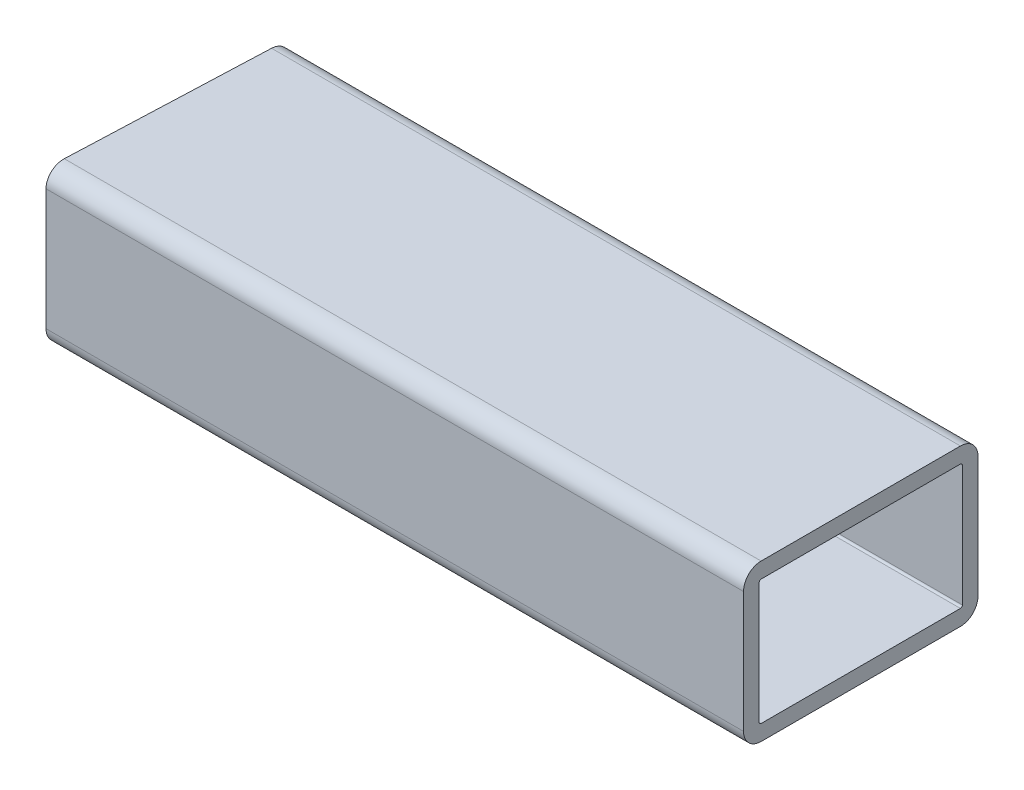
ISO-10303-21;
HEADER;
FILE_DESCRIPTION(('STEP AP214'),'2;1');
FILE_NAME('part.step','',(''),(''),'','','');
FILE_SCHEMA(('AUTOMOTIVE_DESIGN { 1 0 10303 214 1 1 1 1 }'));
ENDSEC;
DATA;
#1=APPLICATION_CONTEXT('core data for automotive mechanical design processes');
#2=APPLICATION_PROTOCOL_DEFINITION('international standard','automotive_design',2000,#1);
#3=PRODUCT_CONTEXT('',#1,'mechanical');
#4=PRODUCT('Part','Part','',(#3));
#5=PRODUCT_RELATED_PRODUCT_CATEGORY('part','',(#4));
#6=PRODUCT_DEFINITION_FORMATION('','',#4);
#7=PRODUCT_DEFINITION_CONTEXT('part definition',#1,'design');
#8=PRODUCT_DEFINITION('design','',#6,#7);
#9=PRODUCT_DEFINITION_SHAPE('','',#8);
#10=(LENGTH_UNIT() NAMED_UNIT(*) SI_UNIT(.MILLI.,.METRE.));
#11=(NAMED_UNIT(*) PLANE_ANGLE_UNIT() SI_UNIT($,.RADIAN.));
#12=(NAMED_UNIT(*) SI_UNIT($,.STERADIAN.) SOLID_ANGLE_UNIT());
#13=UNCERTAINTY_MEASURE_WITH_UNIT(LENGTH_MEASURE(1.E-05),#10,'distance_accuracy_value','');
#14=(GEOMETRIC_REPRESENTATION_CONTEXT(3) GLOBAL_UNCERTAINTY_ASSIGNED_CONTEXT((#13)) GLOBAL_UNIT_ASSIGNED_CONTEXT((#10,
#11,#12)) REPRESENTATION_CONTEXT('',''));
#15=CARTESIAN_POINT('',(0.,0.,0.));
#16=DIRECTION('',(0.,0.,1.));
#17=DIRECTION('',(1.,0.,0.));
#18=AXIS2_PLACEMENT_3D('',#15,#16,#17);
#19=CARTESIAN_POINT('',(178.5,15.5,25.5));
#20=DIRECTION('',(-1.,0.,0.));
#21=DIRECTION('',(0.,0.,1.));
#22=AXIS2_PLACEMENT_3D('',#19,#20,#21);
#23=CYLINDRICAL_SURFACE('',#22,4.5);
#24=DIRECTION('',(-1.,0.,0.));
#25=VECTOR('',#24,1.);
#26=CARTESIAN_POINT('',(178.5,20.,25.5));
#27=LINE('',#26,#25);
#28=CARTESIAN_POINT('',(178.5,20.,25.5));
#29=VERTEX_POINT('',#28);
#30=CARTESIAN_POINT('',(0.180000000000001,20.,25.5));
#31=VERTEX_POINT('',#30);
#32=EDGE_CURVE('E204',#29,#31,#27,.T.);
#33=ORIENTED_EDGE('',*,*,#32,.T.);
#34=CARTESIAN_POINT('',(0.180000000000013,15.5,25.5));
#35=DIRECTION('',(0.999200958721789,0.,0.0399680383488718));
#36=DIRECTION('',(-0.0399680383488718,0.,0.999200958721789));
#37=AXIS2_PLACEMENT_3D('',#34,#35,#36);
#38=ELLIPSE('',#37,4.50359856115085,4.5);
#39=CARTESIAN_POINT('',(0.,15.5,30.));
#40=VERTEX_POINT('',#39);
#41=EDGE_CURVE('E203',#31,#40,#38,.T.);
#42=ORIENTED_EDGE('',*,*,#41,.T.);
#43=DIRECTION('',(-1.,0.,0.));
#44=VECTOR('',#43,1.);
#45=CARTESIAN_POINT('',(178.5,15.5,30.));
#46=LINE('',#45,#44);
#47=CARTESIAN_POINT('',(178.5,15.5,30.));
#48=VERTEX_POINT('',#47);
#49=EDGE_CURVE('E12',#48,#40,#46,.T.);
#50=ORIENTED_EDGE('',*,*,#49,.F.);
#51=CARTESIAN_POINT('',(178.5,15.5,25.5));
#52=DIRECTION('',(1.,0.,0.));
#53=DIRECTION('',(0.,0.,-1.));
#54=AXIS2_PLACEMENT_3D('',#51,#52,#53);
#55=CIRCLE('',#54,4.5);
#56=EDGE_CURVE('E273',#29,#48,#55,.T.);
#57=ORIENTED_EDGE('',*,*,#56,.F.);
#58=EDGE_LOOP('',(#33,#42,#50,#57));
#59=FACE_BOUND('',#58,.T.);
#60=ADVANCED_FACE('F80',(#59),#23,.T.);
#61=CARTESIAN_POINT('',(178.5,15.5,30.));
#62=DIRECTION('',(0.,0.,-1.));
#63=DIRECTION('',(-1.,0.,0.));
#64=AXIS2_PLACEMENT_3D('',#61,#62,#63);
#65=PLANE('',#64);
#66=DIRECTION('',(0.,-1.,0.));
#67=VECTOR('',#66,1.);
#68=CARTESIAN_POINT('',(0.,15.5,30.));
#69=LINE('',#68,#67);
#70=CARTESIAN_POINT('',(0.,-15.5,30.));
#71=VERTEX_POINT('',#70);
#72=EDGE_CURVE('E200',#40,#71,#69,.T.);
#73=ORIENTED_EDGE('',*,*,#72,.T.);
#74=DIRECTION('',(-1.,0.,0.));
#75=VECTOR('',#74,1.);
#76=CARTESIAN_POINT('',(178.5,-15.5,30.));
#77=LINE('',#76,#75);
#78=CARTESIAN_POINT('',(178.5,-15.5,30.));
#79=VERTEX_POINT('',#78);
#80=EDGE_CURVE('E89',#79,#71,#77,.T.);
#81=ORIENTED_EDGE('',*,*,#80,.F.);
#82=DIRECTION('',(0.,-1.,0.));
#83=VECTOR('',#82,1.);
#84=CARTESIAN_POINT('',(178.5,15.5,30.));
#85=LINE('',#84,#83);
#86=EDGE_CURVE('E275',#48,#79,#85,.T.);
#87=ORIENTED_EDGE('',*,*,#86,.F.);
#88=ORIENTED_EDGE('',*,*,#49,.T.);
#89=EDGE_LOOP('',(#73,#81,#87,#88));
#90=FACE_BOUND('',#89,.T.);
#91=ADVANCED_FACE('F362',(#90),#65,.F.);
#92=CARTESIAN_POINT('',(178.5,-15.5,25.5));
#93=DIRECTION('',(-1.,0.,0.));
#94=DIRECTION('',(0.,0.,1.));
#95=AXIS2_PLACEMENT_3D('',#92,#93,#94);
#96=CYLINDRICAL_SURFACE('',#95,4.5);
#97=ORIENTED_EDGE('',*,*,#80,.T.);
#98=CARTESIAN_POINT('',(0.180000000000013,-15.5,25.5));
#99=DIRECTION('',(0.999200958721789,0.,0.0399680383488718));
#100=DIRECTION('',(-0.0399680383488718,0.,0.999200958721789));
#101=AXIS2_PLACEMENT_3D('',#98,#99,#100);
#102=ELLIPSE('',#101,4.50359856115085,4.5);
#103=CARTESIAN_POINT('',(0.180000000000001,-20.,25.5));
#104=VERTEX_POINT('',#103);
#105=EDGE_CURVE('E119',#71,#104,#102,.T.);
#106=ORIENTED_EDGE('',*,*,#105,.T.);
#107=DIRECTION('',(-1.,0.,0.));
#108=VECTOR('',#107,1.);
#109=CARTESIAN_POINT('',(178.5,-20.,25.5));
#110=LINE('',#109,#108);
#111=CARTESIAN_POINT('',(178.5,-20.,25.5));
#112=VERTEX_POINT('',#111);
#113=EDGE_CURVE('E212',#112,#104,#110,.T.);
#114=ORIENTED_EDGE('',*,*,#113,.F.);
#115=CARTESIAN_POINT('',(178.5,-15.5,25.5));
#116=DIRECTION('',(1.,0.,0.));
#117=DIRECTION('',(0.,0.,-1.));
#118=AXIS2_PLACEMENT_3D('',#115,#116,#117);
#119=CIRCLE('',#118,4.5);
#120=EDGE_CURVE('E277',#79,#112,#119,.T.);
#121=ORIENTED_EDGE('',*,*,#120,.F.);
#122=EDGE_LOOP('',(#97,#106,#114,#121));
#123=FACE_BOUND('',#122,.T.);
#124=ADVANCED_FACE('F364',(#123),#96,.T.);
#125=CARTESIAN_POINT('',(178.5,-20.,-25.5));
#126=DIRECTION('',(0.,1.,0.));
#127=DIRECTION('',(0.,0.,1.));
#128=AXIS2_PLACEMENT_3D('',#125,#126,#127);
#129=PLANE('',#128);
#130=ORIENTED_EDGE('',*,*,#113,.T.);
#131=DIRECTION('',(0.0399680383488718,0.,-0.999200958721789));
#132=VECTOR('',#131,1.);
#133=CARTESIAN_POINT('',(0.,-20.,30.));
#134=LINE('',#133,#132);
#135=CARTESIAN_POINT('',(2.22000000000001,-20.,-25.5));
#136=VERTEX_POINT('',#135);
#137=EDGE_CURVE('E288',#104,#136,#134,.T.);
#138=ORIENTED_EDGE('',*,*,#137,.T.);
#139=DIRECTION('',(-1.,0.,0.));
#140=VECTOR('',#139,1.);
#141=CARTESIAN_POINT('',(178.5,-20.,-25.5));
#142=LINE('',#141,#140);
#143=CARTESIAN_POINT('',(178.5,-20.,-25.5));
#144=VERTEX_POINT('',#143);
#145=EDGE_CURVE('E209',#144,#136,#142,.T.);
#146=ORIENTED_EDGE('',*,*,#145,.F.);
#147=DIRECTION('',(0.,0.,-1.));
#148=VECTOR('',#147,1.);
#149=CARTESIAN_POINT('',(178.5,-20.,-25.5));
#150=LINE('',#149,#148);
#151=EDGE_CURVE('E279',#112,#144,#150,.T.);
#152=ORIENTED_EDGE('',*,*,#151,.F.);
#153=EDGE_LOOP('',(#130,#138,#146,#152));
#154=FACE_BOUND('',#153,.T.);
#155=ADVANCED_FACE('F286',(#154),#129,.F.);
#156=CARTESIAN_POINT('',(178.5,-15.5,-25.5));
#157=DIRECTION('',(-1.,0.,0.));
#158=DIRECTION('',(0.,0.,1.));
#159=AXIS2_PLACEMENT_3D('',#156,#157,#158);
#160=CYLINDRICAL_SURFACE('',#159,4.5);
#161=ORIENTED_EDGE('',*,*,#145,.T.);
#162=CARTESIAN_POINT('',(2.22,-15.5,-25.5));
#163=DIRECTION('',(0.999200958721789,0.,0.0399680383488718));
#164=DIRECTION('',(-0.0399680383488718,0.,0.999200958721789));
#165=AXIS2_PLACEMENT_3D('',#162,#163,#164);
#166=ELLIPSE('',#165,4.50359856115085,4.5);
#167=CARTESIAN_POINT('',(2.40000000000001,-15.5,-30.));
#168=VERTEX_POINT('',#167);
#169=EDGE_CURVE('E294',#136,#168,#166,.T.);
#170=ORIENTED_EDGE('',*,*,#169,.T.);
#171=DIRECTION('',(-1.,0.,0.));
#172=VECTOR('',#171,1.);
#173=CARTESIAN_POINT('',(178.5,-15.5,-30.));
#174=LINE('',#173,#172);
#175=CARTESIAN_POINT('',(178.5,-15.5,-30.));
#176=VERTEX_POINT('',#175);
#177=EDGE_CURVE('E190',#176,#168,#174,.T.);
#178=ORIENTED_EDGE('',*,*,#177,.F.);
#179=CARTESIAN_POINT('',(178.5,-15.5,-25.5));
#180=DIRECTION('',(1.,0.,0.));
#181=DIRECTION('',(0.,0.,-1.));
#182=AXIS2_PLACEMENT_3D('',#179,#180,#181);
#183=CIRCLE('',#182,4.5);
#184=EDGE_CURVE('E176',#144,#176,#183,.T.);
#185=ORIENTED_EDGE('',*,*,#184,.F.);
#186=EDGE_LOOP('',(#161,#170,#178,#185));
#187=FACE_BOUND('',#186,.T.);
#188=ADVANCED_FACE('F291',(#187),#160,.T.);
#189=CARTESIAN_POINT('',(178.5,-15.5,-30.));
#190=DIRECTION('',(0.,0.,1.));
#191=DIRECTION('',(1.,0.,0.));
#192=AXIS2_PLACEMENT_3D('',#189,#190,#191);
#193=PLANE('',#192);
#194=ORIENTED_EDGE('',*,*,#177,.T.);
#195=DIRECTION('',(0.,1.,0.));
#196=VECTOR('',#195,1.);
#197=CARTESIAN_POINT('',(2.40000000000001,-20.,-30.));
#198=LINE('',#197,#196);
#199=CARTESIAN_POINT('',(2.4,15.5,-30.));
#200=VERTEX_POINT('',#199);
#201=EDGE_CURVE('E187',#168,#200,#198,.T.);
#202=ORIENTED_EDGE('',*,*,#201,.T.);
#203=DIRECTION('',(-1.,0.,0.));
#204=VECTOR('',#203,1.);
#205=CARTESIAN_POINT('',(178.5,15.5,-30.));
#206=LINE('',#205,#204);
#207=CARTESIAN_POINT('',(178.5,15.5,-30.));
#208=VERTEX_POINT('',#207);
#209=EDGE_CURVE('E183',#208,#200,#206,.T.);
#210=ORIENTED_EDGE('',*,*,#209,.F.);
#211=DIRECTION('',(0.,1.,0.));
#212=VECTOR('',#211,1.);
#213=CARTESIAN_POINT('',(178.5,-15.5,-30.));
#214=LINE('',#213,#212);
#215=EDGE_CURVE('E169',#176,#208,#214,.T.);
#216=ORIENTED_EDGE('',*,*,#215,.F.);
#217=EDGE_LOOP('',(#194,#202,#210,#216));
#218=FACE_BOUND('',#217,.T.);
#219=ADVANCED_FACE('F184',(#218),#193,.F.);
#220=CARTESIAN_POINT('',(178.5,15.5,-25.5));
#221=DIRECTION('',(-1.,0.,0.));
#222=DIRECTION('',(0.,0.,1.));
#223=AXIS2_PLACEMENT_3D('',#220,#221,#222);
#224=CYLINDRICAL_SURFACE('',#223,4.5);
#225=ORIENTED_EDGE('',*,*,#209,.T.);
#226=CARTESIAN_POINT('',(2.22,15.5,-25.5));
#227=DIRECTION('',(0.999200958721789,0.,0.0399680383488718));
#228=DIRECTION('',(-0.0399680383488718,0.,0.999200958721789));
#229=AXIS2_PLACEMENT_3D('',#226,#227,#228);
#230=ELLIPSE('',#229,4.50359856115085,4.5);
#231=CARTESIAN_POINT('',(2.22000000000001,20.,-25.5));
#232=VERTEX_POINT('',#231);
#233=EDGE_CURVE('E349',#200,#232,#230,.T.);
#234=ORIENTED_EDGE('',*,*,#233,.T.);
#235=DIRECTION('',(-1.,0.,0.));
#236=VECTOR('',#235,1.);
#237=CARTESIAN_POINT('',(178.5,20.,-25.5));
#238=LINE('',#237,#236);
#239=CARTESIAN_POINT('',(178.5,20.,-25.5));
#240=VERTEX_POINT('',#239);
#241=EDGE_CURVE('E191',#240,#232,#238,.T.);
#242=ORIENTED_EDGE('',*,*,#241,.F.);
#243=CARTESIAN_POINT('',(178.5,15.5,-25.5));
#244=DIRECTION('',(1.,0.,0.));
#245=DIRECTION('',(0.,0.,-1.));
#246=AXIS2_PLACEMENT_3D('',#243,#244,#245);
#247=CIRCLE('',#246,4.5);
#248=EDGE_CURVE('E173',#208,#240,#247,.T.);
#249=ORIENTED_EDGE('',*,*,#248,.F.);
#250=EDGE_LOOP('',(#225,#234,#242,#249));
#251=FACE_BOUND('',#250,.T.);
#252=ADVANCED_FACE('F193',(#251),#224,.T.);
#253=CARTESIAN_POINT('',(178.5,-15.5,25.5));
#254=DIRECTION('',(-1.,0.,0.));
#255=DIRECTION('',(0.,0.,1.));
#256=AXIS2_PLACEMENT_3D('',#253,#254,#255);
#257=CYLINDRICAL_SURFACE('',#256,0.499999999999998);
#258=CARTESIAN_POINT('',(0.180000000000013,-15.5,25.5));
#259=DIRECTION('',(0.999200958721789,0.,0.0399680383488718));
#260=DIRECTION('',(-0.0399680383488718,0.,0.999200958721789));
#261=AXIS2_PLACEMENT_3D('',#258,#259,#260);
#262=ELLIPSE('',#261,0.50039984012787,0.499999999999998);
#263=CARTESIAN_POINT('',(0.159999999999993,-15.5,26.));
#264=VERTEX_POINT('',#263);
#265=CARTESIAN_POINT('',(0.179999999999998,-16.,25.5));
#266=VERTEX_POINT('',#265);
#267=EDGE_CURVE('E97',#264,#266,#262,.T.);
#268=ORIENTED_EDGE('',*,*,#267,.F.);
#269=DIRECTION('',(-1.,0.,0.));
#270=VECTOR('',#269,1.);
#271=CARTESIAN_POINT('',(178.5,-15.5,26.));
#272=LINE('',#271,#270);
#273=CARTESIAN_POINT('',(178.5,-15.5,26.));
#274=VERTEX_POINT('',#273);
#275=EDGE_CURVE('E84',#274,#264,#272,.T.);
#276=ORIENTED_EDGE('',*,*,#275,.F.);
#277=CARTESIAN_POINT('',(178.5,-15.5,25.5));
#278=DIRECTION('',(1.,0.,0.));
#279=DIRECTION('',(0.,0.,-1.));
#280=AXIS2_PLACEMENT_3D('',#277,#278,#279);
#281=CIRCLE('',#280,0.499999999999998);
#282=CARTESIAN_POINT('',(178.5,-16.,25.5));
#283=VERTEX_POINT('',#282);
#284=EDGE_CURVE('E202',#274,#283,#281,.T.);
#285=ORIENTED_EDGE('',*,*,#284,.T.);
#286=DIRECTION('',(-1.,0.,0.));
#287=VECTOR('',#286,1.);
#288=CARTESIAN_POINT('',(178.5,-16.,25.5));
#289=LINE('',#288,#287);
#290=EDGE_CURVE('E196',#283,#266,#289,.T.);
#291=ORIENTED_EDGE('',*,*,#290,.T.);
#292=EDGE_LOOP('',(#268,#276,#285,#291));
#293=FACE_BOUND('',#292,.T.);
#294=ADVANCED_FACE('F82',(#293),#257,.F.);
#295=CARTESIAN_POINT('',(178.5,15.5,26.));
#296=DIRECTION('',(0.,0.,-1.));
#297=DIRECTION('',(-1.,0.,0.));
#298=AXIS2_PLACEMENT_3D('',#295,#296,#297);
#299=PLANE('',#298);
#300=DIRECTION('',(0.,-1.,0.));
#301=VECTOR('',#300,1.);
#302=CARTESIAN_POINT('',(0.159999999999993,15.5,26.));
#303=LINE('',#302,#301);
#304=CARTESIAN_POINT('',(0.159999999999993,15.5,26.));
#305=VERTEX_POINT('',#304);
#306=EDGE_CURVE('E128',#305,#264,#303,.T.);
#307=ORIENTED_EDGE('',*,*,#306,.F.);
#308=DIRECTION('',(-1.,0.,0.));
#309=VECTOR('',#308,1.);
#310=CARTESIAN_POINT('',(178.5,15.5,26.));
#311=LINE('',#310,#309);
#312=CARTESIAN_POINT('',(178.5,15.5,26.));
#313=VERTEX_POINT('',#312);
#314=EDGE_CURVE('E233',#313,#305,#311,.T.);
#315=ORIENTED_EDGE('',*,*,#314,.F.);
#316=DIRECTION('',(0.,-1.,0.));
#317=VECTOR('',#316,1.);
#318=CARTESIAN_POINT('',(178.5,15.5,26.));
#319=LINE('',#318,#317);
#320=EDGE_CURVE('E243',#313,#274,#319,.T.);
#321=ORIENTED_EDGE('',*,*,#320,.T.);
#322=ORIENTED_EDGE('',*,*,#275,.T.);
#323=EDGE_LOOP('',(#307,#315,#321,#322));
#324=FACE_BOUND('',#323,.T.);
#325=ADVANCED_FACE('F241',(#324),#299,.T.);
#326=CARTESIAN_POINT('',(178.5,15.5,25.5));
#327=DIRECTION('',(-1.,0.,0.));
#328=DIRECTION('',(0.,0.,1.));
#329=AXIS2_PLACEMENT_3D('',#326,#327,#328);
#330=CYLINDRICAL_SURFACE('',#329,0.499999999999998);
#331=CARTESIAN_POINT('',(0.180000000000013,15.5,25.5));
#332=DIRECTION('',(0.999200958721789,0.,0.0399680383488718));
#333=DIRECTION('',(-0.0399680383488718,0.,0.999200958721789));
#334=AXIS2_PLACEMENT_3D('',#331,#332,#333);
#335=ELLIPSE('',#334,0.50039984012787,0.499999999999998);
#336=CARTESIAN_POINT('',(0.179999999999999,16.,25.5));
#337=VERTEX_POINT('',#336);
#338=EDGE_CURVE('E316',#337,#305,#335,.T.);
#339=ORIENTED_EDGE('',*,*,#338,.F.);
#340=DIRECTION('',(-1.,0.,0.));
#341=VECTOR('',#340,1.);
#342=CARTESIAN_POINT('',(178.5,16.,25.5));
#343=LINE('',#342,#341);
#344=CARTESIAN_POINT('',(178.5,16.,25.5));
#345=VERTEX_POINT('',#344);
#346=EDGE_CURVE('E231',#345,#337,#343,.T.);
#347=ORIENTED_EDGE('',*,*,#346,.F.);
#348=CARTESIAN_POINT('',(178.5,15.5,25.5));
#349=DIRECTION('',(1.,0.,0.));
#350=DIRECTION('',(0.,0.,-1.));
#351=AXIS2_PLACEMENT_3D('',#348,#349,#350);
#352=CIRCLE('',#351,0.499999999999998);
#353=EDGE_CURVE('E254',#345,#313,#352,.T.);
#354=ORIENTED_EDGE('',*,*,#353,.T.);
#355=ORIENTED_EDGE('',*,*,#314,.T.);
#356=EDGE_LOOP('',(#339,#347,#354,#355));
#357=FACE_BOUND('',#356,.T.);
#358=ADVANCED_FACE('F321',(#357),#330,.F.);
#359=CARTESIAN_POINT('',(178.5,16.,25.5));
#360=DIRECTION('',(0.,-1.,0.));
#361=DIRECTION('',(0.,0.,-1.));
#362=AXIS2_PLACEMENT_3D('',#359,#360,#361);
#363=PLANE('',#362);
#364=DIRECTION('',(-0.0399680383488718,0.,0.999200958721789));
#365=VECTOR('',#364,1.);
#366=CARTESIAN_POINT('',(0.464856230031951,16.,18.3785942492012));
#367=LINE('',#366,#365);
#368=CARTESIAN_POINT('',(2.22,16.,-25.5));
#369=VERTEX_POINT('',#368);
#370=EDGE_CURVE('E314',#369,#337,#367,.T.);
#371=ORIENTED_EDGE('',*,*,#370,.F.);
#372=DIRECTION('',(-1.,0.,0.));
#373=VECTOR('',#372,1.);
#374=CARTESIAN_POINT('',(178.5,16.,-25.5));
#375=LINE('',#374,#373);
#376=CARTESIAN_POINT('',(178.5,16.,-25.5));
#377=VERTEX_POINT('',#376);
#378=EDGE_CURVE('E228',#377,#369,#375,.T.);
#379=ORIENTED_EDGE('',*,*,#378,.F.);
#380=DIRECTION('',(0.,0.,1.));
#381=VECTOR('',#380,1.);
#382=CARTESIAN_POINT('',(178.5,16.,25.5));
#383=LINE('',#382,#381);
#384=EDGE_CURVE('E260',#377,#345,#383,.T.);
#385=ORIENTED_EDGE('',*,*,#384,.T.);
#386=ORIENTED_EDGE('',*,*,#346,.T.);
#387=EDGE_LOOP('',(#371,#379,#385,#386));
#388=FACE_BOUND('',#387,.T.);
#389=ADVANCED_FACE('F323',(#388),#363,.T.);
#390=CARTESIAN_POINT('',(178.5,15.5,-25.5));
#391=DIRECTION('',(-1.,0.,0.));
#392=DIRECTION('',(0.,0.,1.));
#393=AXIS2_PLACEMENT_3D('',#390,#391,#392);
#394=CYLINDRICAL_SURFACE('',#393,0.499999999999998);
#395=CARTESIAN_POINT('',(2.22,15.5,-25.5));
#396=DIRECTION('',(0.999200958721789,0.,0.0399680383488718));
#397=DIRECTION('',(-0.0399680383488718,0.,0.999200958721789));
#398=AXIS2_PLACEMENT_3D('',#395,#396,#397);
#399=ELLIPSE('',#398,0.50039984012787,0.499999999999998);
#400=CARTESIAN_POINT('',(2.23999999999999,15.5,-26.));
#401=VERTEX_POINT('',#400);
#402=EDGE_CURVE('E318',#401,#369,#399,.T.);
#403=ORIENTED_EDGE('',*,*,#402,.F.);
#404=DIRECTION('',(-1.,0.,0.));
#405=VECTOR('',#404,1.);
#406=CARTESIAN_POINT('',(178.5,15.5,-26.));
#407=LINE('',#406,#405);
#408=CARTESIAN_POINT('',(178.5,15.5,-26.));
#409=VERTEX_POINT('',#408);
#410=EDGE_CURVE('E225',#409,#401,#407,.T.);
#411=ORIENTED_EDGE('',*,*,#410,.F.);
#412=CARTESIAN_POINT('',(178.5,15.5,-25.5));
#413=DIRECTION('',(1.,0.,0.));
#414=DIRECTION('',(0.,0.,-1.));
#415=AXIS2_PLACEMENT_3D('',#412,#413,#414);
#416=CIRCLE('',#415,0.499999999999998);
#417=EDGE_CURVE('E263',#409,#377,#416,.T.);
#418=ORIENTED_EDGE('',*,*,#417,.T.);
#419=ORIENTED_EDGE('',*,*,#378,.T.);
#420=EDGE_LOOP('',(#403,#411,#418,#419));
#421=FACE_BOUND('',#420,.T.);
#422=ADVANCED_FACE('F328',(#421),#394,.F.);
#423=CARTESIAN_POINT('',(178.5,-15.5,-26.));
#424=DIRECTION('',(0.,0.,1.));
#425=DIRECTION('',(1.,0.,0.));
#426=AXIS2_PLACEMENT_3D('',#423,#424,#425);
#427=PLANE('',#426);
#428=DIRECTION('',(0.,1.,0.));
#429=VECTOR('',#428,1.);
#430=CARTESIAN_POINT('',(2.23999999999999,-15.5,-26.));
#431=LINE('',#430,#429);
#432=CARTESIAN_POINT('',(2.24000000000002,-15.5,-26.));
#433=VERTEX_POINT('',#432);
#434=EDGE_CURVE('E332',#433,#401,#431,.T.);
#435=ORIENTED_EDGE('',*,*,#434,.F.);
#436=DIRECTION('',(-1.,0.,0.));
#437=VECTOR('',#436,1.);
#438=CARTESIAN_POINT('',(178.5,-15.5,-26.));
#439=LINE('',#438,#437);
#440=CARTESIAN_POINT('',(178.5,-15.5,-26.));
#441=VERTEX_POINT('',#440);
#442=EDGE_CURVE('E222',#441,#433,#439,.T.);
#443=ORIENTED_EDGE('',*,*,#442,.F.);
#444=DIRECTION('',(0.,1.,0.));
#445=VECTOR('',#444,1.);
#446=CARTESIAN_POINT('',(178.5,-15.5,-26.));
#447=LINE('',#446,#445);
#448=EDGE_CURVE('E266',#441,#409,#447,.T.);
#449=ORIENTED_EDGE('',*,*,#448,.T.);
#450=ORIENTED_EDGE('',*,*,#410,.T.);
#451=EDGE_LOOP('',(#435,#443,#449,#450));
#452=FACE_BOUND('',#451,.T.);
#453=ADVANCED_FACE('F331',(#452),#427,.T.);
#454=CARTESIAN_POINT('',(178.5,-15.5,-25.5));
#455=DIRECTION('',(-1.,0.,0.));
#456=DIRECTION('',(0.,0.,1.));
#457=AXIS2_PLACEMENT_3D('',#454,#455,#456);
#458=CYLINDRICAL_SURFACE('',#457,0.499999999999998);
#459=CARTESIAN_POINT('',(2.22,-15.5,-25.5));
#460=DIRECTION('',(0.999200958721789,0.,0.0399680383488718));
#461=DIRECTION('',(-0.0399680383488718,0.,0.999200958721789));
#462=AXIS2_PLACEMENT_3D('',#459,#460,#461);
#463=ELLIPSE('',#462,0.50039984012787,0.499999999999998);
#464=CARTESIAN_POINT('',(2.21999999999999,-16.,-25.5));
#465=VERTEX_POINT('',#464);
#466=EDGE_CURVE('E336',#465,#433,#463,.T.);
#467=ORIENTED_EDGE('',*,*,#466,.F.);
#468=DIRECTION('',(-1.,0.,0.));
#469=VECTOR('',#468,1.);
#470=CARTESIAN_POINT('',(178.5,-16.,-25.5));
#471=LINE('',#470,#469);
#472=CARTESIAN_POINT('',(178.5,-16.,-25.5));
#473=VERTEX_POINT('',#472);
#474=EDGE_CURVE('E219',#473,#465,#471,.T.);
#475=ORIENTED_EDGE('',*,*,#474,.F.);
#476=CARTESIAN_POINT('',(178.5,-15.5,-25.5));
#477=DIRECTION('',(1.,0.,0.));
#478=DIRECTION('',(0.,0.,-1.));
#479=AXIS2_PLACEMENT_3D('',#476,#477,#478);
#480=CIRCLE('',#479,0.499999999999998);
#481=EDGE_CURVE('E269',#473,#441,#480,.T.);
#482=ORIENTED_EDGE('',*,*,#481,.T.);
#483=ORIENTED_EDGE('',*,*,#442,.T.);
#484=EDGE_LOOP('',(#467,#475,#482,#483));
#485=FACE_BOUND('',#484,.T.);
#486=ADVANCED_FACE('F335',(#485),#458,.F.);
#487=CARTESIAN_POINT('',(178.5,-16.,-25.5));
#488=DIRECTION('',(0.,1.,0.));
#489=DIRECTION('',(0.,0.,1.));
#490=AXIS2_PLACEMENT_3D('',#487,#488,#489);
#491=PLANE('',#490);
#492=DIRECTION('',(0.0399680383488718,0.,-0.999200958721789));
#493=VECTOR('',#492,1.);
#494=CARTESIAN_POINT('',(2.50159744408945,-16.,-32.5399361022365));
#495=LINE('',#494,#493);
#496=EDGE_CURVE('E339',#266,#465,#495,.T.);
#497=ORIENTED_EDGE('',*,*,#496,.F.);
#498=ORIENTED_EDGE('',*,*,#290,.F.);
#499=DIRECTION('',(0.,0.,-1.));
#500=VECTOR('',#499,1.);
#501=CARTESIAN_POINT('',(178.5,-16.,-25.5));
#502=LINE('',#501,#500);
#503=EDGE_CURVE('E252',#283,#473,#502,.T.);
#504=ORIENTED_EDGE('',*,*,#503,.T.);
#505=ORIENTED_EDGE('',*,*,#474,.T.);
#506=EDGE_LOOP('',(#497,#498,#504,#505));
#507=FACE_BOUND('',#506,.T.);
#508=ADVANCED_FACE('F338',(#507),#491,.T.);
#509=CARTESIAN_POINT('',(178.5,20.,25.5));
#510=DIRECTION('',(0.,-1.,0.));
#511=DIRECTION('',(0.,0.,-1.));
#512=AXIS2_PLACEMENT_3D('',#509,#510,#511);
#513=PLANE('',#512);
#514=ORIENTED_EDGE('',*,*,#241,.T.);
#515=DIRECTION('',(0.0399680383488718,0.,-0.999200958721789));
#516=VECTOR('',#515,1.);
#517=CARTESIAN_POINT('',(0.,20.,30.));
#518=LINE('',#517,#516);
#519=EDGE_CURVE('E369',#31,#232,#518,.T.);
#520=ORIENTED_EDGE('',*,*,#519,.F.);
#521=ORIENTED_EDGE('',*,*,#32,.F.);
#522=DIRECTION('',(0.,0.,1.));
#523=VECTOR('',#522,1.);
#524=CARTESIAN_POINT('',(178.5,20.,25.5));
#525=LINE('',#524,#523);
#526=EDGE_CURVE('E106',#240,#29,#525,.T.);
#527=ORIENTED_EDGE('',*,*,#526,.F.);
#528=EDGE_LOOP('',(#514,#520,#521,#527));
#529=FACE_BOUND('',#528,.T.);
#530=ADVANCED_FACE('F371',(#529),#513,.F.);
#531=CARTESIAN_POINT('',(178.5,15.5,25.5));
#532=DIRECTION('',(1.,0.,0.));
#533=DIRECTION('',(0.,0.,-1.));
#534=AXIS2_PLACEMENT_3D('',#531,#532,#533);
#535=PLANE('',#534);
#536=ORIENTED_EDGE('',*,*,#284,.F.);
#537=ORIENTED_EDGE('',*,*,#320,.F.);
#538=ORIENTED_EDGE('',*,*,#353,.F.);
#539=ORIENTED_EDGE('',*,*,#384,.F.);
#540=ORIENTED_EDGE('',*,*,#417,.F.);
#541=ORIENTED_EDGE('',*,*,#448,.F.);
#542=ORIENTED_EDGE('',*,*,#481,.F.);
#543=ORIENTED_EDGE('',*,*,#503,.F.);
#544=EDGE_LOOP('',(#536,#537,#538,#539,#540,#541,#542,#543));
#545=FACE_BOUND('',#544,.T.);
#546=ORIENTED_EDGE('',*,*,#56,.T.);
#547=ORIENTED_EDGE('',*,*,#86,.T.);
#548=ORIENTED_EDGE('',*,*,#120,.T.);
#549=ORIENTED_EDGE('',*,*,#151,.T.);
#550=ORIENTED_EDGE('',*,*,#184,.T.);
#551=ORIENTED_EDGE('',*,*,#215,.T.);
#552=ORIENTED_EDGE('',*,*,#248,.T.);
#553=ORIENTED_EDGE('',*,*,#526,.T.);
#554=EDGE_LOOP('',(#546,#547,#548,#549,#550,#551,#552,#553));
#555=FACE_BOUND('',#554,.T.);
#556=ADVANCED_FACE('F171',(#545,#555),#535,.T.);
#557=CARTESIAN_POINT('',(0.,-20.,30.));
#558=DIRECTION('',(0.999200958721789,0.,0.0399680383488718));
#559=DIRECTION('',(0.0399680383488718,0.,-0.999200958721789));
#560=AXIS2_PLACEMENT_3D('',#557,#558,#559);
#561=PLANE('',#560);
#562=ORIENTED_EDGE('',*,*,#267,.T.);
#563=ORIENTED_EDGE('',*,*,#496,.T.);
#564=ORIENTED_EDGE('',*,*,#466,.T.);
#565=ORIENTED_EDGE('',*,*,#434,.T.);
#566=ORIENTED_EDGE('',*,*,#402,.T.);
#567=ORIENTED_EDGE('',*,*,#370,.T.);
#568=ORIENTED_EDGE('',*,*,#338,.T.);
#569=ORIENTED_EDGE('',*,*,#306,.T.);
#570=EDGE_LOOP('',(#562,#563,#564,#565,#566,#567,#568,#569));
#571=FACE_BOUND('',#570,.T.);
#572=ORIENTED_EDGE('',*,*,#519,.T.);
#573=ORIENTED_EDGE('',*,*,#233,.F.);
#574=ORIENTED_EDGE('',*,*,#201,.F.);
#575=ORIENTED_EDGE('',*,*,#169,.F.);
#576=ORIENTED_EDGE('',*,*,#137,.F.);
#577=ORIENTED_EDGE('',*,*,#105,.F.);
#578=ORIENTED_EDGE('',*,*,#72,.F.);
#579=ORIENTED_EDGE('',*,*,#41,.F.);
#580=EDGE_LOOP('',(#572,#573,#574,#575,#576,#577,#578,#579));
#581=FACE_BOUND('',#580,.T.);
#582=ADVANCED_FACE('F315',(#571,#581),#561,.F.);
#583=CLOSED_SHELL('',(#60,#91,#124,#155,#188,#219,#252,#294,#325,#358,#389,#422,#453,#486,#508,
#530,#556,#582));
#584=MANIFOLD_SOLID_BREP('B2',#583);
#585=ADVANCED_BREP_SHAPE_REPRESENTATION('',(#18,#584),#14);
#586=SHAPE_DEFINITION_REPRESENTATION(#9,#585);
ENDSEC;
END-ISO-10303-21;
